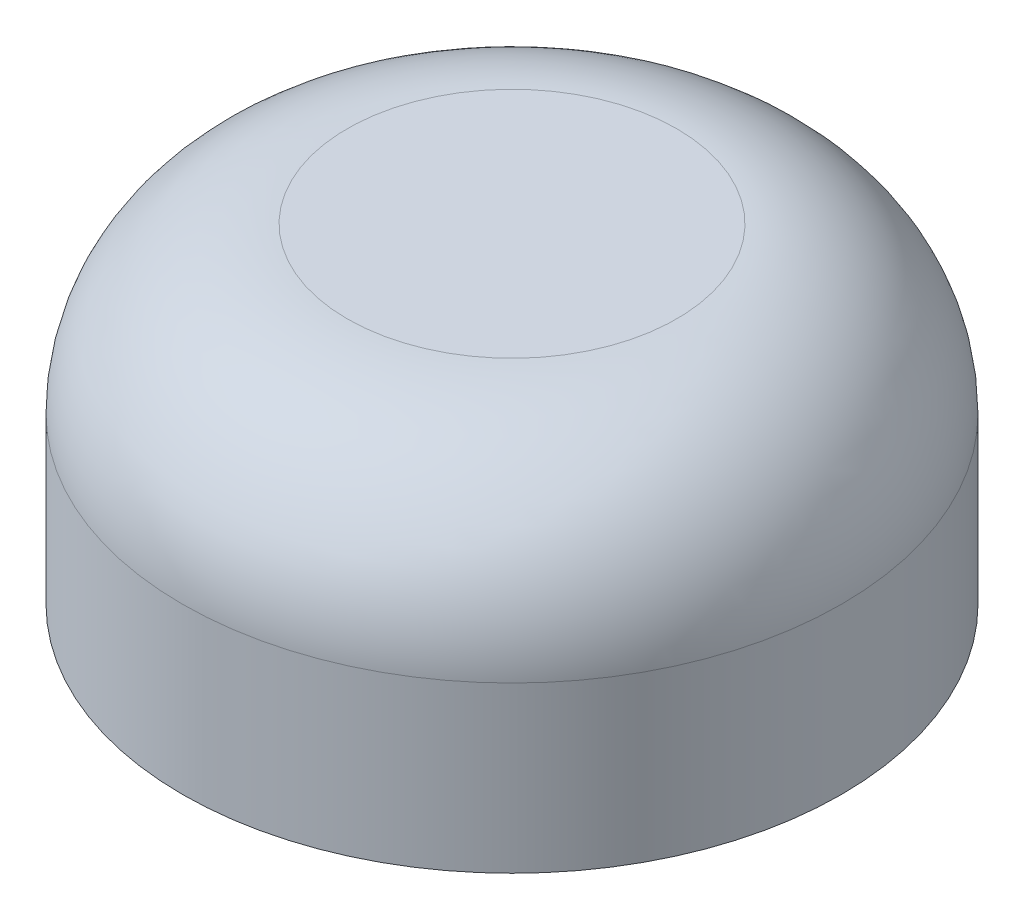
ISO-10303-21;
HEADER;
FILE_DESCRIPTION(('STEP AP214'),'2;1');
FILE_NAME('part.step','',(''),(''),'','','');
FILE_SCHEMA(('AUTOMOTIVE_DESIGN { 1 0 10303 214 1 1 1 1 }'));
ENDSEC;
DATA;
#1=APPLICATION_CONTEXT('core data for automotive mechanical design processes');
#2=APPLICATION_PROTOCOL_DEFINITION('international standard','automotive_design',2000,#1);
#3=PRODUCT_CONTEXT('',#1,'mechanical');
#4=PRODUCT('Part','Part','',(#3));
#5=PRODUCT_RELATED_PRODUCT_CATEGORY('part','',(#4));
#6=PRODUCT_DEFINITION_FORMATION('','',#4);
#7=PRODUCT_DEFINITION_CONTEXT('part definition',#1,'design');
#8=PRODUCT_DEFINITION('design','',#6,#7);
#9=PRODUCT_DEFINITION_SHAPE('','',#8);
#10=(LENGTH_UNIT() NAMED_UNIT(*) SI_UNIT(.MILLI.,.METRE.));
#11=(NAMED_UNIT(*) PLANE_ANGLE_UNIT() SI_UNIT($,.RADIAN.));
#12=(NAMED_UNIT(*) SI_UNIT($,.STERADIAN.) SOLID_ANGLE_UNIT());
#13=UNCERTAINTY_MEASURE_WITH_UNIT(LENGTH_MEASURE(1.E-05),#10,'distance_accuracy_value','');
#14=(GEOMETRIC_REPRESENTATION_CONTEXT(3) GLOBAL_UNCERTAINTY_ASSIGNED_CONTEXT((#13)) GLOBAL_UNIT_ASSIGNED_CONTEXT((#10,
#11,#12)) REPRESENTATION_CONTEXT('',''));
#15=CARTESIAN_POINT('',(0.,0.,0.));
#16=DIRECTION('',(0.,0.,1.));
#17=DIRECTION('',(1.,0.,0.));
#18=AXIS2_PLACEMENT_3D('',#15,#16,#17);
#19=CARTESIAN_POINT('',(0.,6.35,0.));
#20=DIRECTION('',(0.,-1.,0.));
#21=DIRECTION('',(0.,0.,-1.));
#22=AXIS2_PLACEMENT_3D('',#19,#20,#21);
#23=CYLINDRICAL_SURFACE('',#22,6.35);
#24=CARTESIAN_POINT('',(0.,3.175,0.));
#25=DIRECTION('',(0.,1.,0.));
#26=DIRECTION('',(0.,0.,1.));
#27=AXIS2_PLACEMENT_3D('',#24,#25,#26);
#28=CIRCLE('',#27,6.35);
#29=CARTESIAN_POINT('',(0.,3.175,6.35));
#30=VERTEX_POINT('',#29);
#31=EDGE_CURVE('E10',#30,#30,#28,.F.);
#32=ORIENTED_EDGE('',*,*,#31,.T.);
#33=EDGE_LOOP('',(#32));
#34=FACE_BOUND('',#33,.T.);
#35=CARTESIAN_POINT('',(0.,0.,0.));
#36=DIRECTION('',(0.,1.,0.));
#37=DIRECTION('',(0.,0.,1.));
#38=AXIS2_PLACEMENT_3D('',#35,#36,#37);
#39=CIRCLE('',#38,6.35);
#40=CARTESIAN_POINT('',(0.,0.,6.35));
#41=VERTEX_POINT('',#40);
#42=EDGE_CURVE('E48',#41,#41,#39,.T.);
#43=ORIENTED_EDGE('',*,*,#42,.T.);
#44=EDGE_LOOP('',(#43));
#45=FACE_BOUND('',#44,.T.);
#46=ADVANCED_FACE('F37',(#34,#45),#23,.T.);
#47=CARTESIAN_POINT('',(0.,6.35,0.));
#48=DIRECTION('',(0.,1.,0.));
#49=DIRECTION('',(0.,0.,1.));
#50=AXIS2_PLACEMENT_3D('',#47,#48,#49);
#51=PLANE('',#50);
#52=CARTESIAN_POINT('',(0.,6.35,0.));
#53=DIRECTION('',(0.,1.,0.));
#54=DIRECTION('',(0.,0.,1.));
#55=AXIS2_PLACEMENT_3D('',#52,#53,#54);
#56=CIRCLE('',#55,3.175);
#57=CARTESIAN_POINT('',(0.,6.35,3.175));
#58=VERTEX_POINT('',#57);
#59=EDGE_CURVE('E44',#58,#58,#56,.T.);
#60=ORIENTED_EDGE('',*,*,#59,.T.);
#61=EDGE_LOOP('',(#60));
#62=FACE_BOUND('',#61,.T.);
#63=ADVANCED_FACE('F72',(#62),#51,.T.);
#64=CARTESIAN_POINT('',(0.,0.,0.));
#65=DIRECTION('',(0.,1.,0.));
#66=DIRECTION('',(0.,0.,1.));
#67=AXIS2_PLACEMENT_3D('',#64,#65,#66);
#68=PLANE('',#67);
#69=CARTESIAN_POINT('',(0.,0.,0.));
#70=DIRECTION('',(0.,-1.,0.));
#71=DIRECTION('',(0.,0.,-1.));
#72=AXIS2_PLACEMENT_3D('',#69,#70,#71);
#73=CIRCLE('',#72,3.175);
#74=CARTESIAN_POINT('',(0.,0.,-3.175));
#75=VERTEX_POINT('',#74);
#76=EDGE_CURVE('E55',#75,#75,#73,.T.);
#77=ORIENTED_EDGE('',*,*,#76,.F.);
#78=EDGE_LOOP('',(#77));
#79=FACE_BOUND('',#78,.T.);
#80=ORIENTED_EDGE('',*,*,#42,.F.);
#81=EDGE_LOOP('',(#80));
#82=FACE_BOUND('',#81,.T.);
#83=ADVANCED_FACE('F66',(#79,#82),#68,.F.);
#84=CARTESIAN_POINT('',(0.,3.556,0.));
#85=DIRECTION('',(0.,-1.,0.));
#86=DIRECTION('',(0.,0.,-1.));
#87=AXIS2_PLACEMENT_3D('',#84,#85,#86);
#88=CYLINDRICAL_SURFACE('',#87,3.175);
#89=CARTESIAN_POINT('',(0.,3.556,0.));
#90=DIRECTION('',(0.,-1.,0.));
#91=DIRECTION('',(0.,0.,-1.));
#92=AXIS2_PLACEMENT_3D('',#89,#90,#91);
#93=CIRCLE('',#92,3.175);
#94=CARTESIAN_POINT('',(0.,3.556,-3.175));
#95=VERTEX_POINT('',#94);
#96=EDGE_CURVE('E52',#95,#95,#93,.T.);
#97=ORIENTED_EDGE('',*,*,#96,.F.);
#98=EDGE_LOOP('',(#97));
#99=FACE_BOUND('',#98,.T.);
#100=ORIENTED_EDGE('',*,*,#76,.T.);
#101=EDGE_LOOP('',(#100));
#102=FACE_BOUND('',#101,.T.);
#103=ADVANCED_FACE('F63',(#99,#102),#88,.F.);
#104=CARTESIAN_POINT('',(0.,3.556,0.));
#105=DIRECTION('',(0.,-1.,0.));
#106=DIRECTION('',(0.,0.,-1.));
#107=AXIS2_PLACEMENT_3D('',#104,#105,#106);
#108=PLANE('',#107);
#109=ORIENTED_EDGE('',*,*,#96,.T.);
#110=EDGE_LOOP('',(#109));
#111=FACE_BOUND('',#110,.T.);
#112=ADVANCED_FACE('F61',(#111),#108,.T.);
#113=CARTESIAN_POINT('',(0.,3.175,0.));
#114=DIRECTION('',(0.,1.,0.));
#115=DIRECTION('',(0.,0.,1.));
#116=AXIS2_PLACEMENT_3D('',#113,#114,#115);
#117=DEGENERATE_TOROIDAL_SURFACE('',#116,3.175,3.175,.T.);
#118=ORIENTED_EDGE('',*,*,#31,.F.);
#119=EDGE_LOOP('',(#118));
#120=FACE_BOUND('',#119,.T.);
#121=ORIENTED_EDGE('',*,*,#59,.F.);
#122=EDGE_LOOP('',(#121));
#123=FACE_BOUND('',#122,.T.);
#124=ADVANCED_FACE('F39',(#120,#123),#117,.T.);
#125=CLOSED_SHELL('',(#46,#63,#83,#103,#112,#124));
#126=MANIFOLD_SOLID_BREP('B2',#125);
#127=ADVANCED_BREP_SHAPE_REPRESENTATION('',(#18,#126),#14);
#128=SHAPE_DEFINITION_REPRESENTATION(#9,#127);
ENDSEC;
END-ISO-10303-21;
